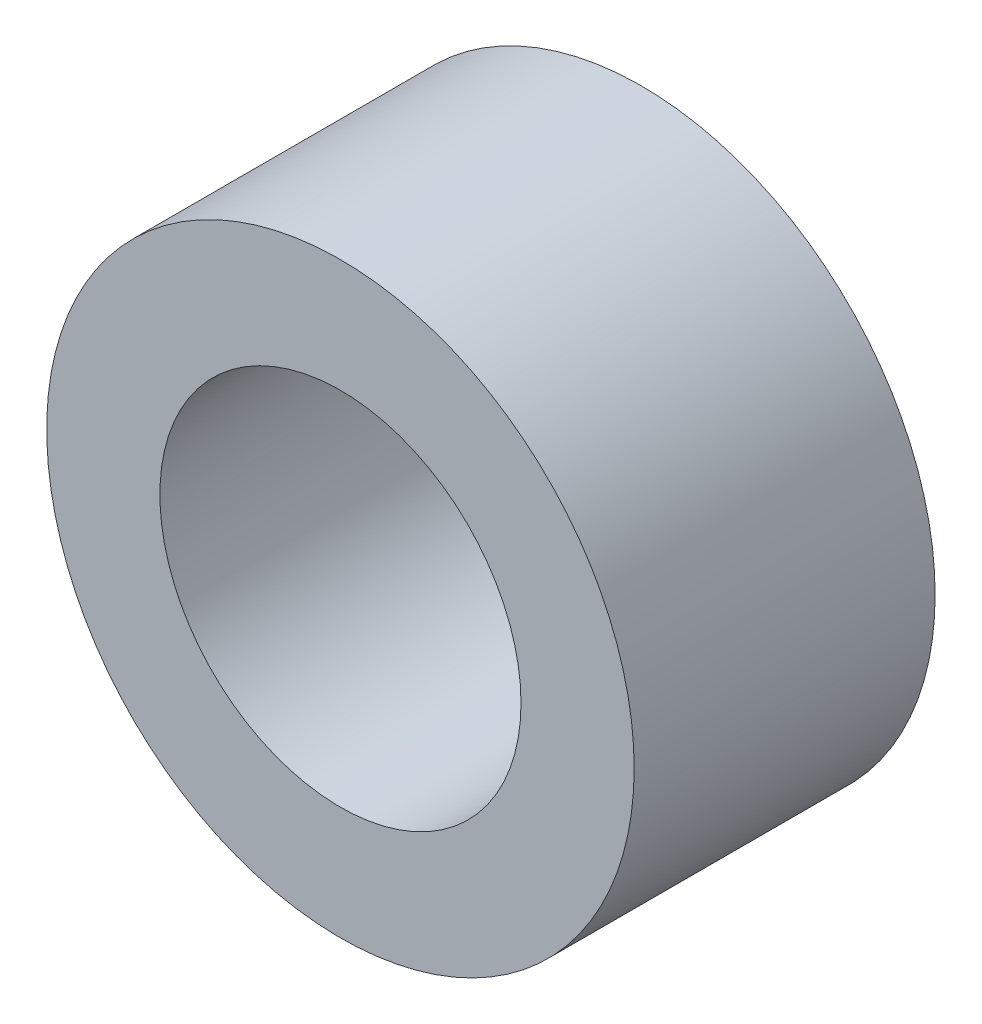
ISO-10303-21;
HEADER;
FILE_DESCRIPTION(('STEP AP214'),'2;1');
FILE_NAME('part.step','',(''),(''),'','','');
FILE_SCHEMA(('AUTOMOTIVE_DESIGN { 1 0 10303 214 1 1 1 1 }'));
ENDSEC;
DATA;
#1=APPLICATION_CONTEXT('core data for automotive mechanical design processes');
#2=APPLICATION_PROTOCOL_DEFINITION('international standard','automotive_design',2000,#1);
#3=PRODUCT_CONTEXT('',#1,'mechanical');
#4=PRODUCT('Part','Part','',(#3));
#5=PRODUCT_RELATED_PRODUCT_CATEGORY('part','',(#4));
#6=PRODUCT_DEFINITION_FORMATION('','',#4);
#7=PRODUCT_DEFINITION_CONTEXT('part definition',#1,'design');
#8=PRODUCT_DEFINITION('design','',#6,#7);
#9=PRODUCT_DEFINITION_SHAPE('','',#8);
#10=(LENGTH_UNIT() NAMED_UNIT(*) SI_UNIT(.MILLI.,.METRE.));
#11=(NAMED_UNIT(*) PLANE_ANGLE_UNIT() SI_UNIT($,.RADIAN.));
#12=(NAMED_UNIT(*) SI_UNIT($,.STERADIAN.) SOLID_ANGLE_UNIT());
#13=UNCERTAINTY_MEASURE_WITH_UNIT(LENGTH_MEASURE(1.E-05),#10,'distance_accuracy_value','');
#14=(GEOMETRIC_REPRESENTATION_CONTEXT(3) GLOBAL_UNCERTAINTY_ASSIGNED_CONTEXT((#13)) GLOBAL_UNIT_ASSIGNED_CONTEXT((#10,
#11,#12)) REPRESENTATION_CONTEXT('',''));
#15=CARTESIAN_POINT('',(0.,0.,0.));
#16=DIRECTION('',(0.,0.,1.));
#17=DIRECTION('',(1.,0.,0.));
#18=AXIS2_PLACEMENT_3D('',#15,#16,#17);
#19=CARTESIAN_POINT('',(0.,0.,5.));
#20=DIRECTION('',(0.,0.,1.));
#21=DIRECTION('',(1.,0.,0.));
#22=AXIS2_PLACEMENT_3D('',#19,#20,#21);
#23=PLANE('',#22);
#24=CARTESIAN_POINT('',(0.,0.,5.));
#25=DIRECTION('',(0.,0.,1.));
#26=DIRECTION('',(1.,0.,0.));
#27=AXIS2_PLACEMENT_3D('',#24,#25,#26);
#28=CIRCLE('',#27,4.88047456097694);
#29=CARTESIAN_POINT('',(4.88047456097694,0.,5.));
#30=VERTEX_POINT('',#29);
#31=EDGE_CURVE('E10',#30,#30,#28,.T.);
#32=ORIENTED_EDGE('',*,*,#31,.T.);
#33=EDGE_LOOP('',(#32));
#34=FACE_BOUND('',#33,.T.);
#35=CARTESIAN_POINT('',(0.,0.,5.));
#36=DIRECTION('',(0.,0.,1.));
#37=DIRECTION('',(1.,0.,0.));
#38=AXIS2_PLACEMENT_3D('',#35,#36,#37);
#39=CIRCLE('',#38,3.);
#40=CARTESIAN_POINT('',(3.,0.,5.));
#41=VERTEX_POINT('',#40);
#42=EDGE_CURVE('E42',#41,#41,#39,.T.);
#43=ORIENTED_EDGE('',*,*,#42,.F.);
#44=EDGE_LOOP('',(#43));
#45=FACE_BOUND('',#44,.T.);
#46=ADVANCED_FACE('F31',(#34,#45),#23,.T.);
#47=CARTESIAN_POINT('',(0.,0.,0.));
#48=DIRECTION('',(0.,0.,1.));
#49=DIRECTION('',(1.,0.,0.));
#50=AXIS2_PLACEMENT_3D('',#47,#48,#49);
#51=PLANE('',#50);
#52=CARTESIAN_POINT('',(0.,0.,0.));
#53=DIRECTION('',(0.,0.,1.));
#54=DIRECTION('',(1.,0.,0.));
#55=AXIS2_PLACEMENT_3D('',#52,#53,#54);
#56=CIRCLE('',#55,4.88047456097694);
#57=CARTESIAN_POINT('',(4.88047456097694,0.,0.));
#58=VERTEX_POINT('',#57);
#59=EDGE_CURVE('E35',#58,#58,#56,.T.);
#60=ORIENTED_EDGE('',*,*,#59,.F.);
#61=EDGE_LOOP('',(#60));
#62=FACE_BOUND('',#61,.T.);
#63=CARTESIAN_POINT('',(0.,0.,0.));
#64=DIRECTION('',(0.,0.,1.));
#65=DIRECTION('',(1.,0.,0.));
#66=AXIS2_PLACEMENT_3D('',#63,#64,#65);
#67=CIRCLE('',#66,3.);
#68=CARTESIAN_POINT('',(3.,0.,0.));
#69=VERTEX_POINT('',#68);
#70=EDGE_CURVE('E44',#69,#69,#67,.T.);
#71=ORIENTED_EDGE('',*,*,#70,.T.);
#72=EDGE_LOOP('',(#71));
#73=FACE_BOUND('',#72,.T.);
#74=ADVANCED_FACE('F54',(#62,#73),#51,.F.);
#75=CARTESIAN_POINT('',(0.,0.,5.));
#76=DIRECTION('',(0.,0.,-1.));
#77=DIRECTION('',(-1.,0.,0.));
#78=AXIS2_PLACEMENT_3D('',#75,#76,#77);
#79=CYLINDRICAL_SURFACE('',#78,4.88047456097694);
#80=ORIENTED_EDGE('',*,*,#31,.F.);
#81=EDGE_LOOP('',(#80));
#82=FACE_BOUND('',#81,.T.);
#83=ORIENTED_EDGE('',*,*,#59,.T.);
#84=EDGE_LOOP('',(#83));
#85=FACE_BOUND('',#84,.T.);
#86=ADVANCED_FACE('F33',(#82,#85),#79,.T.);
#87=CARTESIAN_POINT('',(0.,0.,5.));
#88=DIRECTION('',(0.,0.,-1.));
#89=DIRECTION('',(-1.,0.,0.));
#90=AXIS2_PLACEMENT_3D('',#87,#88,#89);
#91=CYLINDRICAL_SURFACE('',#90,3.);
#92=ORIENTED_EDGE('',*,*,#42,.T.);
#93=EDGE_LOOP('',(#92));
#94=FACE_BOUND('',#93,.T.);
#95=ORIENTED_EDGE('',*,*,#70,.F.);
#96=EDGE_LOOP('',(#95));
#97=FACE_BOUND('',#96,.T.);
#98=ADVANCED_FACE('F50',(#94,#97),#91,.F.);
#99=CLOSED_SHELL('',(#46,#74,#86,#98));
#100=MANIFOLD_SOLID_BREP('B2',#99);
#101=ADVANCED_BREP_SHAPE_REPRESENTATION('',(#18,#100),#14);
#102=SHAPE_DEFINITION_REPRESENTATION(#9,#101);
ENDSEC;
END-ISO-10303-21;
